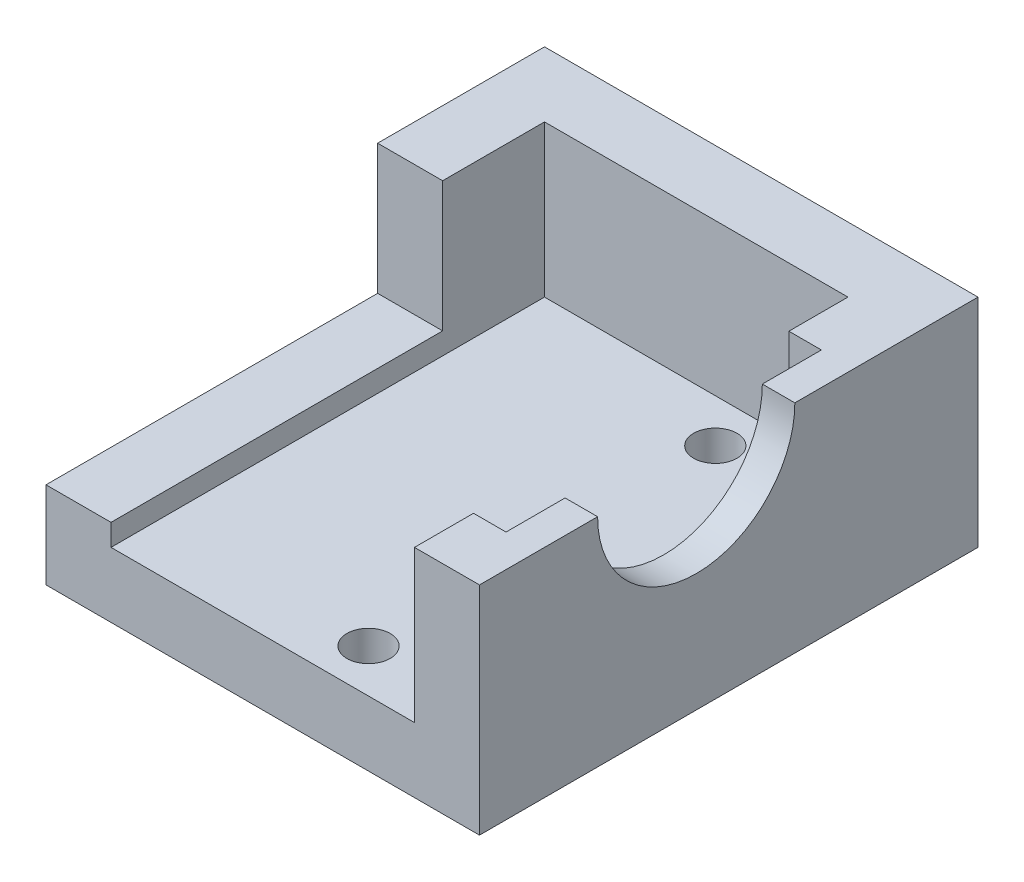
ISO-10303-21;
HEADER;
FILE_DESCRIPTION(('STEP AP214'),'2;1');
FILE_NAME('part.step','',(''),(''),'','','');
FILE_SCHEMA(('AUTOMOTIVE_DESIGN { 1 0 10303 214 1 1 1 1 }'));
ENDSEC;
DATA;
#1=APPLICATION_CONTEXT('core data for automotive mechanical design processes');
#2=APPLICATION_PROTOCOL_DEFINITION('international standard','automotive_design',2000,#1);
#3=PRODUCT_CONTEXT('',#1,'mechanical');
#4=PRODUCT('Part','Part','',(#3));
#5=PRODUCT_RELATED_PRODUCT_CATEGORY('part','',(#4));
#6=PRODUCT_DEFINITION_FORMATION('','',#4);
#7=PRODUCT_DEFINITION_CONTEXT('part definition',#1,'design');
#8=PRODUCT_DEFINITION('design','',#6,#7);
#9=PRODUCT_DEFINITION_SHAPE('','',#8);
#10=(LENGTH_UNIT() NAMED_UNIT(*) SI_UNIT(.MILLI.,.METRE.));
#11=(NAMED_UNIT(*) PLANE_ANGLE_UNIT() SI_UNIT($,.RADIAN.));
#12=(NAMED_UNIT(*) SI_UNIT($,.STERADIAN.) SOLID_ANGLE_UNIT());
#13=UNCERTAINTY_MEASURE_WITH_UNIT(LENGTH_MEASURE(1.E-05),#10,'distance_accuracy_value','');
#14=(GEOMETRIC_REPRESENTATION_CONTEXT(3) GLOBAL_UNCERTAINTY_ASSIGNED_CONTEXT((#13)) GLOBAL_UNIT_ASSIGNED_CONTEXT((#10,
#11,#12)) REPRESENTATION_CONTEXT('',''));
#15=CARTESIAN_POINT('',(0.,0.,0.));
#16=DIRECTION('',(0.,0.,1.));
#17=DIRECTION('',(1.,0.,0.));
#18=AXIS2_PLACEMENT_3D('',#15,#16,#17);
#19=CARTESIAN_POINT('',(-10.,10.,11.5));
#20=DIRECTION('',(1.,0.,0.));
#21=DIRECTION('',(0.,0.,-1.));
#22=AXIS2_PLACEMENT_3D('',#19,#20,#21);
#23=PLANE('',#22);
#24=DIRECTION('',(0.,-1.,0.));
#25=VECTOR('',#24,1.);
#26=CARTESIAN_POINT('',(-10.,10.,-3.8));
#27=LINE('',#26,#25);
#28=CARTESIAN_POINT('',(-10.,10.,-3.8));
#29=VERTEX_POINT('',#28);
#30=CARTESIAN_POINT('',(-10.,4.,-3.8));
#31=VERTEX_POINT('',#30);
#32=EDGE_CURVE('E161',#29,#31,#27,.T.);
#33=ORIENTED_EDGE('',*,*,#32,.F.);
#34=DIRECTION('',(0.,0.,1.));
#35=VECTOR('',#34,1.);
#36=CARTESIAN_POINT('',(-10.,10.,11.5));
#37=LINE('',#36,#35);
#38=CARTESIAN_POINT('',(-10.,10.,-11.5));
#39=VERTEX_POINT('',#38);
#40=EDGE_CURVE('E171',#39,#29,#37,.T.);
#41=ORIENTED_EDGE('',*,*,#40,.F.);
#42=DIRECTION('',(0.,-1.,0.));
#43=VECTOR('',#42,1.);
#44=CARTESIAN_POINT('',(-10.,10.,-11.5));
#45=LINE('',#44,#43);
#46=CARTESIAN_POINT('',(-10.,0.,-11.5));
#47=VERTEX_POINT('',#46);
#48=EDGE_CURVE('E194',#39,#47,#45,.T.);
#49=ORIENTED_EDGE('',*,*,#48,.T.);
#50=DIRECTION('',(0.,0.,1.));
#51=VECTOR('',#50,1.);
#52=CARTESIAN_POINT('',(-10.,0.,11.5));
#53=LINE('',#52,#51);
#54=CARTESIAN_POINT('',(-10.,0.,11.5));
#55=VERTEX_POINT('',#54);
#56=EDGE_CURVE('E198',#47,#55,#53,.T.);
#57=ORIENTED_EDGE('',*,*,#56,.T.);
#58=DIRECTION('',(0.,-1.,0.));
#59=VECTOR('',#58,1.);
#60=CARTESIAN_POINT('',(-10.,10.,11.5));
#61=LINE('',#60,#59);
#62=CARTESIAN_POINT('',(-10.,4.,11.5));
#63=VERTEX_POINT('',#62);
#64=EDGE_CURVE('E209',#63,#55,#61,.T.);
#65=ORIENTED_EDGE('',*,*,#64,.F.);
#66=DIRECTION('',(0.,0.,1.));
#67=VECTOR('',#66,1.);
#68=CARTESIAN_POINT('',(-10.,4.,11.5));
#69=LINE('',#68,#67);
#70=EDGE_CURVE('E169',#31,#63,#69,.T.);
#71=ORIENTED_EDGE('',*,*,#70,.F.);
#72=EDGE_LOOP('',(#33,#41,#49,#57,#65,#71));
#73=FACE_BOUND('',#72,.T.);
#74=ADVANCED_FACE('F44',(#73),#23,.F.);
#75=CARTESIAN_POINT('',(0.,10.,0.));
#76=DIRECTION('',(0.,1.,0.));
#77=DIRECTION('',(0.,0.,1.));
#78=AXIS2_PLACEMENT_3D('',#75,#76,#77);
#79=PLANE('',#78);
#80=DIRECTION('',(0.,0.,-1.));
#81=VECTOR('',#80,1.);
#82=CARTESIAN_POINT('',(8.5,10.,-5.775));
#83=LINE('',#82,#81);
#84=CARTESIAN_POINT('',(8.5,10.,8.775));
#85=VERTEX_POINT('',#84);
#86=CARTESIAN_POINT('',(8.5,10.,6.05));
#87=VERTEX_POINT('',#86);
#88=EDGE_CURVE('E67',#85,#87,#83,.T.);
#89=ORIENTED_EDGE('',*,*,#88,.F.);
#90=DIRECTION('',(-1.,0.,0.));
#91=VECTOR('',#90,1.);
#92=CARTESIAN_POINT('',(8.5,10.,8.775));
#93=LINE('',#92,#91);
#94=CARTESIAN_POINT('',(7.,10.,8.775));
#95=VERTEX_POINT('',#94);
#96=EDGE_CURVE('E244',#85,#95,#93,.T.);
#97=ORIENTED_EDGE('',*,*,#96,.T.);
#98=DIRECTION('',(0.,0.,-1.));
#99=VECTOR('',#98,1.);
#100=CARTESIAN_POINT('',(7.,10.,-8.5));
#101=LINE('',#100,#99);
#102=CARTESIAN_POINT('',(7.,10.,11.5));
#103=VERTEX_POINT('',#102);
#104=EDGE_CURVE('E276',#103,#95,#101,.T.);
#105=ORIENTED_EDGE('',*,*,#104,.F.);
#106=DIRECTION('',(1.,0.,0.));
#107=VECTOR('',#106,1.);
#108=CARTESIAN_POINT('',(10.,10.,11.5));
#109=LINE('',#108,#107);
#110=CARTESIAN_POINT('',(10.,10.,11.5));
#111=VERTEX_POINT('',#110);
#112=EDGE_CURVE('E179',#103,#111,#109,.T.);
#113=ORIENTED_EDGE('',*,*,#112,.T.);
#114=DIRECTION('',(0.,0.,-1.));
#115=VECTOR('',#114,1.);
#116=CARTESIAN_POINT('',(10.,10.,11.5));
#117=LINE('',#116,#115);
#118=CARTESIAN_POINT('',(10.,10.,6.05));
#119=VERTEX_POINT('',#118);
#120=EDGE_CURVE('E193',#111,#119,#117,.T.);
#121=ORIENTED_EDGE('',*,*,#120,.T.);
#122=DIRECTION('',(1.,0.,0.));
#123=VECTOR('',#122,1.);
#124=CARTESIAN_POINT('',(3.,10.,6.05));
#125=LINE('',#124,#123);
#126=EDGE_CURVE('E265',#87,#119,#125,.T.);
#127=ORIENTED_EDGE('',*,*,#126,.F.);
#128=EDGE_LOOP('',(#89,#97,#105,#113,#121,#127));
#129=FACE_BOUND('',#128,.T.);
#130=ADVANCED_FACE('F302',(#129),#79,.T.);
#131=CARTESIAN_POINT('',(7.,3.,-8.5));
#132=DIRECTION('',(1.,0.,0.));
#133=DIRECTION('',(0.,0.,-1.));
#134=AXIS2_PLACEMENT_3D('',#131,#132,#133);
#135=PLANE('',#134);
#136=DIRECTION('',(0.,1.,0.));
#137=VECTOR('',#136,1.);
#138=CARTESIAN_POINT('',(7.,10.,8.775));
#139=LINE('',#138,#137);
#140=CARTESIAN_POINT('',(7.,3.,8.775));
#141=VERTEX_POINT('',#140);
#142=EDGE_CURVE('E235',#141,#95,#139,.T.);
#143=ORIENTED_EDGE('',*,*,#142,.F.);
#144=DIRECTION('',(0.,0.,-1.));
#145=VECTOR('',#144,1.);
#146=CARTESIAN_POINT('',(7.,3.,-8.5));
#147=LINE('',#146,#145);
#148=CARTESIAN_POINT('',(7.,3.,11.5));
#149=VERTEX_POINT('',#148);
#150=EDGE_CURVE('E269',#149,#141,#147,.T.);
#151=ORIENTED_EDGE('',*,*,#150,.F.);
#152=DIRECTION('',(0.,1.,0.));
#153=VECTOR('',#152,1.);
#154=CARTESIAN_POINT('',(7.,3.,11.5));
#155=LINE('',#154,#153);
#156=EDGE_CURVE('E186',#149,#103,#155,.T.);
#157=ORIENTED_EDGE('',*,*,#156,.T.);
#158=ORIENTED_EDGE('',*,*,#104,.T.);
#159=EDGE_LOOP('',(#143,#151,#157,#158));
#160=FACE_BOUND('',#159,.T.);
#161=ADVANCED_FACE('F297',(#160),#135,.F.);
#162=DIRECTION('',(0.,-1.,0.));
#163=VECTOR('',#162,1.);
#164=CARTESIAN_POINT('',(7.,10.,-5.775));
#165=LINE('',#164,#163);
#166=CARTESIAN_POINT('',(7.,10.,-5.775));
#167=VERTEX_POINT('',#166);
#168=CARTESIAN_POINT('',(7.,3.,-5.775));
#169=VERTEX_POINT('',#168);
#170=EDGE_CURVE('E240',#167,#169,#165,.T.);
#171=ORIENTED_EDGE('',*,*,#170,.F.);
#172=CARTESIAN_POINT('',(7.,10.,-8.5));
#173=VERTEX_POINT('',#172);
#174=EDGE_CURVE('E262',#167,#173,#101,.T.);
#175=ORIENTED_EDGE('',*,*,#174,.T.);
#176=DIRECTION('',(0.,1.,0.));
#177=VECTOR('',#176,1.);
#178=CARTESIAN_POINT('',(7.,3.,-8.5));
#179=LINE('',#178,#177);
#180=CARTESIAN_POINT('',(7.,3.,-8.5));
#181=VERTEX_POINT('',#180);
#182=EDGE_CURVE('E287',#181,#173,#179,.T.);
#183=ORIENTED_EDGE('',*,*,#182,.F.);
#184=EDGE_CURVE('E268',#169,#181,#147,.T.);
#185=ORIENTED_EDGE('',*,*,#184,.F.);
#186=EDGE_LOOP('',(#171,#175,#183,#185));
#187=FACE_BOUND('',#186,.T.);
#188=ADVANCED_FACE('F327',(#187),#135,.F.);
#189=CARTESIAN_POINT('',(3.,10.,1.5));
#190=DIRECTION('',(1.,0.,0.));
#191=DIRECTION('',(0.,0.,-1.));
#192=AXIS2_PLACEMENT_3D('',#189,#190,#191);
#193=CYLINDRICAL_SURFACE('',#192,4.55);
#194=CARTESIAN_POINT('',(8.5,10.,1.5));
#195=DIRECTION('',(-1.,0.,0.));
#196=DIRECTION('',(0.,0.,1.));
#197=AXIS2_PLACEMENT_3D('',#194,#195,#196);
#198=CIRCLE('',#197,4.55);
#199=CARTESIAN_POINT('',(8.5,10.,-3.05));
#200=VERTEX_POINT('',#199);
#201=EDGE_CURVE('E215',#87,#200,#198,.F.);
#202=ORIENTED_EDGE('',*,*,#201,.F.);
#203=ORIENTED_EDGE('',*,*,#126,.T.);
#204=CARTESIAN_POINT('',(10.,10.,1.5));
#205=DIRECTION('',(1.,0.,0.));
#206=DIRECTION('',(0.,0.,-1.));
#207=AXIS2_PLACEMENT_3D('',#204,#205,#206);
#208=CIRCLE('',#207,4.55);
#209=CARTESIAN_POINT('',(10.,10.,-3.05));
#210=VERTEX_POINT('',#209);
#211=EDGE_CURVE('E253',#119,#210,#208,.T.);
#212=ORIENTED_EDGE('',*,*,#211,.T.);
#213=DIRECTION('',(1.,0.,0.));
#214=VECTOR('',#213,1.);
#215=CARTESIAN_POINT('',(3.,10.,-3.05));
#216=LINE('',#215,#214);
#217=EDGE_CURVE('E259',#210,#200,#216,.F.);
#218=ORIENTED_EDGE('',*,*,#217,.T.);
#219=EDGE_LOOP('',(#202,#203,#212,#218));
#220=FACE_BOUND('',#219,.T.);
#221=ADVANCED_FACE('F316',(#220),#193,.F.);
#222=CARTESIAN_POINT('',(10.,10.,11.5));
#223=DIRECTION('',(-1.,0.,0.));
#224=DIRECTION('',(0.,0.,1.));
#225=AXIS2_PLACEMENT_3D('',#222,#223,#224);
#226=PLANE('',#225);
#227=ORIENTED_EDGE('',*,*,#211,.F.);
#228=ORIENTED_EDGE('',*,*,#120,.F.);
#229=DIRECTION('',(0.,-1.,0.));
#230=VECTOR('',#229,1.);
#231=CARTESIAN_POINT('',(10.,10.,11.5));
#232=LINE('',#231,#230);
#233=CARTESIAN_POINT('',(10.,0.,11.5));
#234=VERTEX_POINT('',#233);
#235=EDGE_CURVE('E210',#111,#234,#232,.T.);
#236=ORIENTED_EDGE('',*,*,#235,.T.);
#237=DIRECTION('',(0.,0.,-1.));
#238=VECTOR('',#237,1.);
#239=CARTESIAN_POINT('',(10.,0.,11.5));
#240=LINE('',#239,#238);
#241=CARTESIAN_POINT('',(10.,0.,-11.5));
#242=VERTEX_POINT('',#241);
#243=EDGE_CURVE('E183',#234,#242,#240,.T.);
#244=ORIENTED_EDGE('',*,*,#243,.T.);
#245=DIRECTION('',(0.,-1.,0.));
#246=VECTOR('',#245,1.);
#247=CARTESIAN_POINT('',(10.,10.,-11.5));
#248=LINE('',#247,#246);
#249=CARTESIAN_POINT('',(10.,10.,-11.5));
#250=VERTEX_POINT('',#249);
#251=EDGE_CURVE('E204',#250,#242,#248,.T.);
#252=ORIENTED_EDGE('',*,*,#251,.F.);
#253=EDGE_CURVE('E181',#210,#250,#117,.T.);
#254=ORIENTED_EDGE('',*,*,#253,.F.);
#255=EDGE_LOOP('',(#227,#228,#236,#244,#252,#254));
#256=FACE_BOUND('',#255,.T.);
#257=ADVANCED_FACE('F315',(#256),#226,.F.);
#258=CARTESIAN_POINT('',(10.,10.,11.5));
#259=DIRECTION('',(0.,0.,-1.));
#260=DIRECTION('',(-1.,0.,0.));
#261=AXIS2_PLACEMENT_3D('',#258,#259,#260);
#262=PLANE('',#261);
#263=DIRECTION('',(0.,1.,0.));
#264=VECTOR('',#263,1.);
#265=CARTESIAN_POINT('',(-7.,3.,11.5));
#266=LINE('',#265,#264);
#267=CARTESIAN_POINT('',(-7.,3.,11.5));
#268=VERTEX_POINT('',#267);
#269=CARTESIAN_POINT('',(-7.,4.,11.5));
#270=VERTEX_POINT('',#269);
#271=EDGE_CURVE('E199',#268,#270,#266,.T.);
#272=ORIENTED_EDGE('',*,*,#271,.T.);
#273=DIRECTION('',(-1.,0.,0.));
#274=VECTOR('',#273,1.);
#275=CARTESIAN_POINT('',(-4.5,4.,11.5));
#276=LINE('',#275,#274);
#277=EDGE_CURVE('E227',#270,#63,#276,.T.);
#278=ORIENTED_EDGE('',*,*,#277,.T.);
#279=ORIENTED_EDGE('',*,*,#64,.T.);
#280=DIRECTION('',(1.,0.,0.));
#281=VECTOR('',#280,1.);
#282=CARTESIAN_POINT('',(10.,0.,11.5));
#283=LINE('',#282,#281);
#284=EDGE_CURVE('E200',#55,#234,#283,.T.);
#285=ORIENTED_EDGE('',*,*,#284,.T.);
#286=ORIENTED_EDGE('',*,*,#235,.F.);
#287=ORIENTED_EDGE('',*,*,#112,.F.);
#288=ORIENTED_EDGE('',*,*,#156,.F.);
#289=DIRECTION('',(1.,0.,0.));
#290=VECTOR('',#289,1.);
#291=CARTESIAN_POINT('',(0.,3.,11.5));
#292=LINE('',#291,#290);
#293=EDGE_CURVE('E264',#268,#149,#292,.T.);
#294=ORIENTED_EDGE('',*,*,#293,.F.);
#295=EDGE_LOOP('',(#272,#278,#279,#285,#286,#287,#288,#294));
#296=FACE_BOUND('',#295,.T.);
#297=ADVANCED_FACE('F308',(#296),#262,.F.);
#298=CARTESIAN_POINT('',(10.,10.,-11.5));
#299=DIRECTION('',(0.,0.,1.));
#300=DIRECTION('',(1.,0.,0.));
#301=AXIS2_PLACEMENT_3D('',#298,#299,#300);
#302=PLANE('',#301);
#303=DIRECTION('',(-1.,0.,0.));
#304=VECTOR('',#303,1.);
#305=CARTESIAN_POINT('',(10.,0.,-11.5));
#306=LINE('',#305,#304);
#307=EDGE_CURVE('E182',#242,#47,#306,.T.);
#308=ORIENTED_EDGE('',*,*,#307,.T.);
#309=ORIENTED_EDGE('',*,*,#48,.F.);
#310=DIRECTION('',(-1.,0.,0.));
#311=VECTOR('',#310,1.);
#312=CARTESIAN_POINT('',(10.,10.,-11.5));
#313=LINE('',#312,#311);
#314=EDGE_CURVE('E176',#250,#39,#313,.T.);
#315=ORIENTED_EDGE('',*,*,#314,.F.);
#316=ORIENTED_EDGE('',*,*,#251,.T.);
#317=EDGE_LOOP('',(#308,#309,#315,#316));
#318=FACE_BOUND('',#317,.T.);
#319=ADVANCED_FACE('F364',(#318),#302,.F.);
#320=DIRECTION('',(-1.,0.,0.));
#321=VECTOR('',#320,1.);
#322=CARTESIAN_POINT('',(-4.5,10.,-3.8));
#323=LINE('',#322,#321);
#324=CARTESIAN_POINT('',(-7.,10.,-3.8));
#325=VERTEX_POINT('',#324);
#326=EDGE_CURVE('E158',#325,#29,#323,.T.);
#327=ORIENTED_EDGE('',*,*,#326,.F.);
#328=DIRECTION('',(0.,0.,1.));
#329=VECTOR('',#328,1.);
#330=CARTESIAN_POINT('',(-7.,10.,11.5));
#331=LINE('',#330,#329);
#332=CARTESIAN_POINT('',(-7.,10.,-8.5));
#333=VERTEX_POINT('',#332);
#334=EDGE_CURVE('E267',#333,#325,#331,.T.);
#335=ORIENTED_EDGE('',*,*,#334,.F.);
#336=DIRECTION('',(-1.,0.,0.));
#337=VECTOR('',#336,1.);
#338=CARTESIAN_POINT('',(-7.,10.,-8.5));
#339=LINE('',#338,#337);
#340=EDGE_CURVE('E285',#173,#333,#339,.T.);
#341=ORIENTED_EDGE('',*,*,#340,.F.);
#342=ORIENTED_EDGE('',*,*,#174,.F.);
#343=DIRECTION('',(-1.,0.,0.));
#344=VECTOR('',#343,1.);
#345=CARTESIAN_POINT('',(8.5,10.,-5.775));
#346=LINE('',#345,#344);
#347=CARTESIAN_POINT('',(8.5,10.,-5.775));
#348=VERTEX_POINT('',#347);
#349=EDGE_CURVE('E255',#348,#167,#346,.T.);
#350=ORIENTED_EDGE('',*,*,#349,.F.);
#351=EDGE_CURVE('E237',#200,#348,#83,.T.);
#352=ORIENTED_EDGE('',*,*,#351,.F.);
#353=ORIENTED_EDGE('',*,*,#217,.F.);
#354=ORIENTED_EDGE('',*,*,#253,.T.);
#355=ORIENTED_EDGE('',*,*,#314,.T.);
#356=ORIENTED_EDGE('',*,*,#40,.T.);
#357=EDGE_LOOP('',(#327,#335,#341,#342,#350,#352,#353,#354,#355,#356));
#358=FACE_BOUND('',#357,.T.);
#359=ADVANCED_FACE('F178',(#358),#79,.T.);
#360=CARTESIAN_POINT('',(0.,0.,0.));
#361=DIRECTION('',(0.,1.,0.));
#362=DIRECTION('',(0.,0.,1.));
#363=AXIS2_PLACEMENT_3D('',#360,#361,#362);
#364=PLANE('',#363);
#365=CARTESIAN_POINT('',(2.88,0.,9.5));
#366=DIRECTION('',(0.,-1.,0.));
#367=DIRECTION('',(0.,0.,-1.));
#368=AXIS2_PLACEMENT_3D('',#365,#366,#367);
#369=CIRCLE('',#368,1.);
#370=CARTESIAN_POINT('',(2.88,0.,8.49999999999999));
#371=VERTEX_POINT('',#370);
#372=EDGE_CURVE('E216',#371,#371,#369,.T.);
#373=ORIENTED_EDGE('',*,*,#372,.F.);
#374=EDGE_LOOP('',(#373));
#375=FACE_BOUND('',#374,.T.);
#376=CARTESIAN_POINT('',(2.88,0.,-6.5));
#377=DIRECTION('',(0.,-1.,0.));
#378=DIRECTION('',(0.,0.,-1.));
#379=AXIS2_PLACEMENT_3D('',#376,#377,#378);
#380=CIRCLE('',#379,1.);
#381=CARTESIAN_POINT('',(2.88,0.,-7.5));
#382=VERTEX_POINT('',#381);
#383=EDGE_CURVE('E222',#382,#382,#380,.T.);
#384=ORIENTED_EDGE('',*,*,#383,.F.);
#385=EDGE_LOOP('',(#384));
#386=FACE_BOUND('',#385,.T.);
#387=ORIENTED_EDGE('',*,*,#56,.F.);
#388=ORIENTED_EDGE('',*,*,#307,.F.);
#389=ORIENTED_EDGE('',*,*,#243,.F.);
#390=ORIENTED_EDGE('',*,*,#284,.F.);
#391=EDGE_LOOP('',(#387,#388,#389,#390));
#392=FACE_BOUND('',#391,.T.);
#393=ADVANCED_FACE('F365',(#375,#386,#392),#364,.F.);
#394=CARTESIAN_POINT('',(-7.,3.,11.5));
#395=DIRECTION('',(-1.,0.,0.));
#396=DIRECTION('',(0.,0.,1.));
#397=AXIS2_PLACEMENT_3D('',#394,#395,#396);
#398=PLANE('',#397);
#399=DIRECTION('',(0.,-1.,0.));
#400=VECTOR('',#399,1.);
#401=CARTESIAN_POINT('',(-7.,3.,-3.8));
#402=LINE('',#401,#400);
#403=CARTESIAN_POINT('',(-7.,4.,-3.8));
#404=VERTEX_POINT('',#403);
#405=EDGE_CURVE('E52',#325,#404,#402,.T.);
#406=ORIENTED_EDGE('',*,*,#405,.T.);
#407=DIRECTION('',(0.,0.,1.));
#408=VECTOR('',#407,1.);
#409=CARTESIAN_POINT('',(-7.,4.,11.5));
#410=LINE('',#409,#408);
#411=EDGE_CURVE('E11',#404,#270,#410,.T.);
#412=ORIENTED_EDGE('',*,*,#411,.T.);
#413=ORIENTED_EDGE('',*,*,#271,.F.);
#414=DIRECTION('',(0.,0.,1.));
#415=VECTOR('',#414,1.);
#416=CARTESIAN_POINT('',(-7.,3.,11.5));
#417=LINE('',#416,#415);
#418=CARTESIAN_POINT('',(-7.,3.,-8.5));
#419=VERTEX_POINT('',#418);
#420=EDGE_CURVE('E277',#419,#268,#417,.T.);
#421=ORIENTED_EDGE('',*,*,#420,.F.);
#422=DIRECTION('',(0.,1.,0.));
#423=VECTOR('',#422,1.);
#424=CARTESIAN_POINT('',(-7.,3.,-8.5));
#425=LINE('',#424,#423);
#426=EDGE_CURVE('E286',#419,#333,#425,.T.);
#427=ORIENTED_EDGE('',*,*,#426,.T.);
#428=ORIENTED_EDGE('',*,*,#334,.T.);
#429=EDGE_LOOP('',(#406,#412,#413,#421,#427,#428));
#430=FACE_BOUND('',#429,.T.);
#431=ADVANCED_FACE('F340',(#430),#398,.F.);
#432=CARTESIAN_POINT('',(-7.,3.,-8.5));
#433=DIRECTION('',(0.,0.,-1.));
#434=DIRECTION('',(-1.,0.,0.));
#435=AXIS2_PLACEMENT_3D('',#432,#433,#434);
#436=PLANE('',#435);
#437=ORIENTED_EDGE('',*,*,#340,.T.);
#438=ORIENTED_EDGE('',*,*,#426,.F.);
#439=DIRECTION('',(-1.,0.,0.));
#440=VECTOR('',#439,1.);
#441=CARTESIAN_POINT('',(-7.,3.,-8.5));
#442=LINE('',#441,#440);
#443=EDGE_CURVE('E272',#181,#419,#442,.T.);
#444=ORIENTED_EDGE('',*,*,#443,.F.);
#445=ORIENTED_EDGE('',*,*,#182,.T.);
#446=EDGE_LOOP('',(#437,#438,#444,#445));
#447=FACE_BOUND('',#446,.T.);
#448=ADVANCED_FACE('F386',(#447),#436,.F.);
#449=CARTESIAN_POINT('',(0.,3.,0.));
#450=DIRECTION('',(0.,-1.,0.));
#451=DIRECTION('',(0.,0.,-1.));
#452=AXIS2_PLACEMENT_3D('',#449,#450,#451);
#453=PLANE('',#452);
#454=CARTESIAN_POINT('',(2.88,3.,9.5));
#455=DIRECTION('',(0.,-1.,0.));
#456=DIRECTION('',(0.,0.,-1.));
#457=AXIS2_PLACEMENT_3D('',#454,#455,#456);
#458=CIRCLE('',#457,1.);
#459=CARTESIAN_POINT('',(2.88,3.,8.49999999999999));
#460=VERTEX_POINT('',#459);
#461=EDGE_CURVE('E48',#460,#460,#458,.T.);
#462=ORIENTED_EDGE('',*,*,#461,.T.);
#463=EDGE_LOOP('',(#462));
#464=FACE_BOUND('',#463,.T.);
#465=CARTESIAN_POINT('',(2.88,3.,-6.5));
#466=DIRECTION('',(0.,-1.,0.));
#467=DIRECTION('',(0.,0.,-1.));
#468=AXIS2_PLACEMENT_3D('',#465,#466,#467);
#469=CIRCLE('',#468,1.);
#470=CARTESIAN_POINT('',(2.88,3.,-7.5));
#471=VERTEX_POINT('',#470);
#472=EDGE_CURVE('E212',#471,#471,#469,.T.);
#473=ORIENTED_EDGE('',*,*,#472,.T.);
#474=EDGE_LOOP('',(#473));
#475=FACE_BOUND('',#474,.T.);
#476=ORIENTED_EDGE('',*,*,#293,.T.);
#477=ORIENTED_EDGE('',*,*,#150,.T.);
#478=DIRECTION('',(-1.,0.,0.));
#479=VECTOR('',#478,1.);
#480=CARTESIAN_POINT('',(8.5,3.,8.775));
#481=LINE('',#480,#479);
#482=CARTESIAN_POINT('',(8.5,3.,8.775));
#483=VERTEX_POINT('',#482);
#484=EDGE_CURVE('E247',#483,#141,#481,.T.);
#485=ORIENTED_EDGE('',*,*,#484,.F.);
#486=DIRECTION('',(0.,0.,1.));
#487=VECTOR('',#486,1.);
#488=CARTESIAN_POINT('',(8.5,3.,-5.775));
#489=LINE('',#488,#487);
#490=CARTESIAN_POINT('',(8.5,3.,-5.775));
#491=VERTEX_POINT('',#490);
#492=EDGE_CURVE('E245',#491,#483,#489,.T.);
#493=ORIENTED_EDGE('',*,*,#492,.F.);
#494=DIRECTION('',(-1.,0.,0.));
#495=VECTOR('',#494,1.);
#496=CARTESIAN_POINT('',(8.5,3.,-5.775));
#497=LINE('',#496,#495);
#498=EDGE_CURVE('E252',#491,#169,#497,.T.);
#499=ORIENTED_EDGE('',*,*,#498,.T.);
#500=ORIENTED_EDGE('',*,*,#184,.T.);
#501=ORIENTED_EDGE('',*,*,#443,.T.);
#502=ORIENTED_EDGE('',*,*,#420,.T.);
#503=EDGE_LOOP('',(#476,#477,#485,#493,#499,#500,#501,#502));
#504=FACE_BOUND('',#503,.T.);
#505=ADVANCED_FACE('F329',(#464,#475,#504),#453,.F.);
#506=CARTESIAN_POINT('',(8.5,0.,0.));
#507=DIRECTION('',(-1.,0.,0.));
#508=DIRECTION('',(0.,0.,1.));
#509=AXIS2_PLACEMENT_3D('',#506,#507,#508);
#510=PLANE('',#509);
#511=ORIENTED_EDGE('',*,*,#201,.T.);
#512=ORIENTED_EDGE('',*,*,#351,.T.);
#513=DIRECTION('',(0.,-1.,0.));
#514=VECTOR('',#513,1.);
#515=CARTESIAN_POINT('',(8.5,10.,-5.775));
#516=LINE('',#515,#514);
#517=EDGE_CURVE('E239',#348,#491,#516,.T.);
#518=ORIENTED_EDGE('',*,*,#517,.T.);
#519=ORIENTED_EDGE('',*,*,#492,.T.);
#520=DIRECTION('',(0.,1.,0.));
#521=VECTOR('',#520,1.);
#522=CARTESIAN_POINT('',(8.5,10.,8.775));
#523=LINE('',#522,#521);
#524=EDGE_CURVE('E232',#483,#85,#523,.T.);
#525=ORIENTED_EDGE('',*,*,#524,.T.);
#526=ORIENTED_EDGE('',*,*,#88,.T.);
#527=EDGE_LOOP('',(#511,#512,#518,#519,#525,#526));
#528=FACE_BOUND('',#527,.T.);
#529=ADVANCED_FACE('F317',(#528),#510,.T.);
#530=CARTESIAN_POINT('',(8.5,10.,8.775));
#531=DIRECTION('',(0.,0.,1.));
#532=DIRECTION('',(1.,0.,0.));
#533=AXIS2_PLACEMENT_3D('',#530,#531,#532);
#534=PLANE('',#533);
#535=ORIENTED_EDGE('',*,*,#142,.T.);
#536=ORIENTED_EDGE('',*,*,#96,.F.);
#537=ORIENTED_EDGE('',*,*,#524,.F.);
#538=ORIENTED_EDGE('',*,*,#484,.T.);
#539=EDGE_LOOP('',(#535,#536,#537,#538));
#540=FACE_BOUND('',#539,.T.);
#541=ADVANCED_FACE('F331',(#540),#534,.F.);
#542=CARTESIAN_POINT('',(8.5,10.,-5.775));
#543=DIRECTION('',(0.,0.,-1.));
#544=DIRECTION('',(-1.,0.,0.));
#545=AXIS2_PLACEMENT_3D('',#542,#543,#544);
#546=PLANE('',#545);
#547=ORIENTED_EDGE('',*,*,#170,.T.);
#548=ORIENTED_EDGE('',*,*,#498,.F.);
#549=ORIENTED_EDGE('',*,*,#517,.F.);
#550=ORIENTED_EDGE('',*,*,#349,.T.);
#551=EDGE_LOOP('',(#547,#548,#549,#550));
#552=FACE_BOUND('',#551,.T.);
#553=ADVANCED_FACE('F324',(#552),#546,.F.);
#554=CARTESIAN_POINT('',(-4.5,4.,11.5));
#555=DIRECTION('',(0.,-1.,0.));
#556=DIRECTION('',(0.,0.,-1.));
#557=AXIS2_PLACEMENT_3D('',#554,#555,#556);
#558=PLANE('',#557);
#559=DIRECTION('',(-1.,0.,0.));
#560=VECTOR('',#559,1.);
#561=CARTESIAN_POINT('',(-4.5,4.,-3.8));
#562=LINE('',#561,#560);
#563=EDGE_CURVE('E63',#404,#31,#562,.T.);
#564=ORIENTED_EDGE('',*,*,#563,.T.);
#565=ORIENTED_EDGE('',*,*,#70,.T.);
#566=ORIENTED_EDGE('',*,*,#277,.F.);
#567=ORIENTED_EDGE('',*,*,#411,.F.);
#568=EDGE_LOOP('',(#564,#565,#566,#567));
#569=FACE_BOUND('',#568,.T.);
#570=ADVANCED_FACE('F337',(#569),#558,.F.);
#571=CARTESIAN_POINT('',(-4.5,10.,-3.8));
#572=DIRECTION('',(0.,0.,-1.));
#573=DIRECTION('',(-1.,0.,0.));
#574=AXIS2_PLACEMENT_3D('',#571,#572,#573);
#575=PLANE('',#574);
#576=ORIENTED_EDGE('',*,*,#326,.T.);
#577=ORIENTED_EDGE('',*,*,#32,.T.);
#578=ORIENTED_EDGE('',*,*,#563,.F.);
#579=ORIENTED_EDGE('',*,*,#405,.F.);
#580=EDGE_LOOP('',(#576,#577,#578,#579));
#581=FACE_BOUND('',#580,.T.);
#582=ADVANCED_FACE('F159',(#581),#575,.F.);
#583=CARTESIAN_POINT('',(2.88,5.5,-6.5));
#584=DIRECTION('',(0.,-1.,0.));
#585=DIRECTION('',(0.,0.,-1.));
#586=AXIS2_PLACEMENT_3D('',#583,#584,#585);
#587=CYLINDRICAL_SURFACE('',#586,1.);
#588=ORIENTED_EDGE('',*,*,#383,.T.);
#589=EDGE_LOOP('',(#588));
#590=FACE_BOUND('',#589,.T.);
#591=ORIENTED_EDGE('',*,*,#472,.F.);
#592=EDGE_LOOP('',(#591));
#593=FACE_BOUND('',#592,.T.);
#594=ADVANCED_FACE('F347',(#590,#593),#587,.F.);
#595=CARTESIAN_POINT('',(2.88,5.5,9.5));
#596=DIRECTION('',(0.,-1.,0.));
#597=DIRECTION('',(0.,0.,-1.));
#598=AXIS2_PLACEMENT_3D('',#595,#596,#597);
#599=CYLINDRICAL_SURFACE('',#598,1.);
#600=ORIENTED_EDGE('',*,*,#372,.T.);
#601=EDGE_LOOP('',(#600));
#602=FACE_BOUND('',#601,.T.);
#603=ORIENTED_EDGE('',*,*,#461,.F.);
#604=EDGE_LOOP('',(#603));
#605=FACE_BOUND('',#604,.T.);
#606=ADVANCED_FACE('F466',(#602,#605),#599,.F.);
#607=CLOSED_SHELL('',(#74,#130,#161,#188,#221,#257,#297,#319,#359,#393,#431,#448,#505,#529,#541,
#553,#570,#582,#594,#606));
#608=MANIFOLD_SOLID_BREP('B2',#607);
#609=ADVANCED_BREP_SHAPE_REPRESENTATION('',(#18,#608),#14);
#610=SHAPE_DEFINITION_REPRESENTATION(#9,#609);
ENDSEC;
END-ISO-10303-21;
